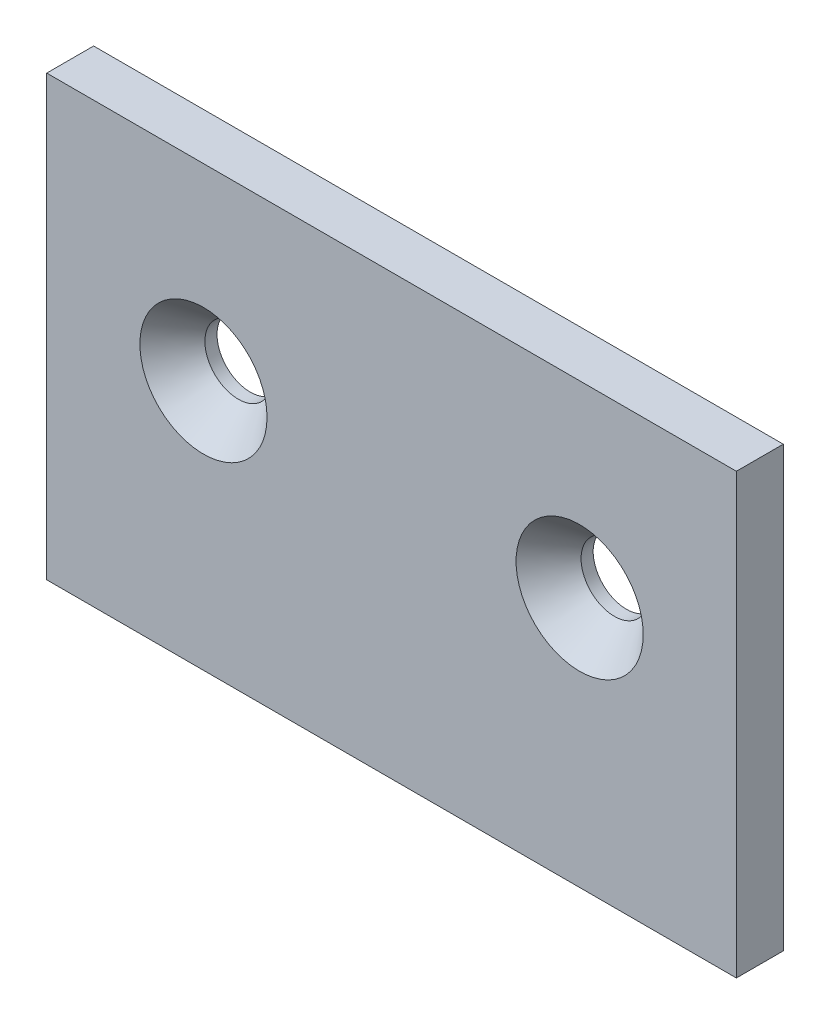
ISO-10303-21;
HEADER;
FILE_DESCRIPTION(('STEP AP214'),'2;1');
FILE_NAME('part.step','',(''),(''),'','','');
FILE_SCHEMA(('AUTOMOTIVE_DESIGN { 1 0 10303 214 1 1 1 1 }'));
ENDSEC;
DATA;
#1=APPLICATION_CONTEXT('core data for automotive mechanical design processes');
#2=APPLICATION_PROTOCOL_DEFINITION('international standard','automotive_design',2000,#1);
#3=PRODUCT_CONTEXT('',#1,'mechanical');
#4=PRODUCT('Part','Part','',(#3));
#5=PRODUCT_RELATED_PRODUCT_CATEGORY('part','',(#4));
#6=PRODUCT_DEFINITION_FORMATION('','',#4);
#7=PRODUCT_DEFINITION_CONTEXT('part definition',#1,'design');
#8=PRODUCT_DEFINITION('design','',#6,#7);
#9=PRODUCT_DEFINITION_SHAPE('','',#8);
#10=(LENGTH_UNIT() NAMED_UNIT(*) SI_UNIT(.MILLI.,.METRE.));
#11=(NAMED_UNIT(*) PLANE_ANGLE_UNIT() SI_UNIT($,.RADIAN.));
#12=(NAMED_UNIT(*) SI_UNIT($,.STERADIAN.) SOLID_ANGLE_UNIT());
#13=UNCERTAINTY_MEASURE_WITH_UNIT(LENGTH_MEASURE(1.E-05),#10,'distance_accuracy_value','');
#14=(GEOMETRIC_REPRESENTATION_CONTEXT(3) GLOBAL_UNCERTAINTY_ASSIGNED_CONTEXT((#13)) GLOBAL_UNIT_ASSIGNED_CONTEXT((#10,
#11,#12)) REPRESENTATION_CONTEXT('',''));
#15=CARTESIAN_POINT('',(0.,0.,0.));
#16=DIRECTION('',(0.,0.,1.));
#17=DIRECTION('',(1.,0.,0.));
#18=AXIS2_PLACEMENT_3D('',#15,#16,#17);
#19=CARTESIAN_POINT('',(-34.925,44.45,-4.7498));
#20=DIRECTION('',(-1.,0.,0.));
#21=DIRECTION('',(0.,-1.,0.));
#22=AXIS2_PLACEMENT_3D('',#19,#20,#21);
#23=PLANE('',#22);
#24=DIRECTION('',(0.,-1.,0.));
#25=VECTOR('',#24,1.);
#26=CARTESIAN_POINT('',(-34.925,44.45,0.));
#27=LINE('',#26,#25);
#28=CARTESIAN_POINT('',(-34.925,44.45,0.));
#29=VERTEX_POINT('',#28);
#30=CARTESIAN_POINT('',(-34.925,0.,0.));
#31=VERTEX_POINT('',#30);
#32=EDGE_CURVE('E105',#29,#31,#27,.T.);
#33=ORIENTED_EDGE('',*,*,#32,.F.);
#34=DIRECTION('',(0.,0.,1.));
#35=VECTOR('',#34,1.);
#36=CARTESIAN_POINT('',(-34.925,44.45,-4.7498));
#37=LINE('',#36,#35);
#38=CARTESIAN_POINT('',(-34.925,44.45,-4.7498));
#39=VERTEX_POINT('',#38);
#40=EDGE_CURVE('E11',#39,#29,#37,.T.);
#41=ORIENTED_EDGE('',*,*,#40,.F.);
#42=DIRECTION('',(0.,-1.,0.));
#43=VECTOR('',#42,1.);
#44=CARTESIAN_POINT('',(-34.925,44.45,-4.7498));
#45=LINE('',#44,#43);
#46=CARTESIAN_POINT('',(-34.925,0.,-4.7498));
#47=VERTEX_POINT('',#46);
#48=EDGE_CURVE('E99',#39,#47,#45,.T.);
#49=ORIENTED_EDGE('',*,*,#48,.T.);
#50=DIRECTION('',(0.,0.,1.));
#51=VECTOR('',#50,1.);
#52=CARTESIAN_POINT('',(-34.925,0.,-4.7498));
#53=LINE('',#52,#51);
#54=EDGE_CURVE('E42',#47,#31,#53,.T.);
#55=ORIENTED_EDGE('',*,*,#54,.T.);
#56=EDGE_LOOP('',(#33,#41,#49,#55));
#57=FACE_BOUND('',#56,.T.);
#58=ADVANCED_FACE('F39',(#57),#23,.T.);
#59=CARTESIAN_POINT('',(-34.925,44.45,-4.7498));
#60=DIRECTION('',(0.,-1.,0.));
#61=DIRECTION('',(1.,0.,0.));
#62=AXIS2_PLACEMENT_3D('',#59,#60,#61);
#63=PLANE('',#62);
#64=DIRECTION('',(1.,0.,0.));
#65=VECTOR('',#64,1.);
#66=CARTESIAN_POINT('',(-34.925,44.45,0.));
#67=LINE('',#66,#65);
#68=CARTESIAN_POINT('',(34.925,44.45,0.));
#69=VERTEX_POINT('',#68);
#70=EDGE_CURVE('E72',#29,#69,#67,.T.);
#71=ORIENTED_EDGE('',*,*,#70,.T.);
#72=DIRECTION('',(0.,0.,1.));
#73=VECTOR('',#72,1.);
#74=CARTESIAN_POINT('',(34.925,44.45,-4.7498));
#75=LINE('',#74,#73);
#76=CARTESIAN_POINT('',(34.925,44.45,-4.7498));
#77=VERTEX_POINT('',#76);
#78=EDGE_CURVE('E48',#77,#69,#75,.T.);
#79=ORIENTED_EDGE('',*,*,#78,.F.);
#80=DIRECTION('',(1.,0.,0.));
#81=VECTOR('',#80,1.);
#82=CARTESIAN_POINT('',(-34.925,44.45,-4.7498));
#83=LINE('',#82,#81);
#84=EDGE_CURVE('E89',#39,#77,#83,.T.);
#85=ORIENTED_EDGE('',*,*,#84,.F.);
#86=ORIENTED_EDGE('',*,*,#40,.T.);
#87=EDGE_LOOP('',(#71,#79,#85,#86));
#88=FACE_BOUND('',#87,.T.);
#89=ADVANCED_FACE('F116',(#88),#63,.F.);
#90=CARTESIAN_POINT('',(34.925,44.45,-4.7498));
#91=DIRECTION('',(-1.,0.,0.));
#92=DIRECTION('',(0.,0.,1.));
#93=AXIS2_PLACEMENT_3D('',#90,#91,#92);
#94=PLANE('',#93);
#95=DIRECTION('',(0.,-1.,0.));
#96=VECTOR('',#95,1.);
#97=CARTESIAN_POINT('',(34.925,44.45,0.));
#98=LINE('',#97,#96);
#99=CARTESIAN_POINT('',(34.925,0.,0.));
#100=VERTEX_POINT('',#99);
#101=EDGE_CURVE('E96',#69,#100,#98,.T.);
#102=ORIENTED_EDGE('',*,*,#101,.T.);
#103=DIRECTION('',(0.,0.,1.));
#104=VECTOR('',#103,1.);
#105=CARTESIAN_POINT('',(34.925,0.,-4.7498));
#106=LINE('',#105,#104);
#107=CARTESIAN_POINT('',(34.925,0.,-4.7498));
#108=VERTEX_POINT('',#107);
#109=EDGE_CURVE('E93',#108,#100,#106,.T.);
#110=ORIENTED_EDGE('',*,*,#109,.F.);
#111=DIRECTION('',(0.,-1.,0.));
#112=VECTOR('',#111,1.);
#113=CARTESIAN_POINT('',(34.925,44.45,-4.7498));
#114=LINE('',#113,#112);
#115=EDGE_CURVE('E84',#77,#108,#114,.T.);
#116=ORIENTED_EDGE('',*,*,#115,.F.);
#117=ORIENTED_EDGE('',*,*,#78,.T.);
#118=EDGE_LOOP('',(#102,#110,#116,#117));
#119=FACE_BOUND('',#118,.T.);
#120=ADVANCED_FACE('F94',(#119),#94,.F.);
#121=CARTESIAN_POINT('',(-34.925,0.,-4.7498));
#122=DIRECTION('',(0.,-1.,0.));
#123=DIRECTION('',(1.,0.,0.));
#124=AXIS2_PLACEMENT_3D('',#121,#122,#123);
#125=PLANE('',#124);
#126=DIRECTION('',(1.,0.,0.));
#127=VECTOR('',#126,1.);
#128=CARTESIAN_POINT('',(-34.925,0.,0.));
#129=LINE('',#128,#127);
#130=EDGE_CURVE('E108',#31,#100,#129,.T.);
#131=ORIENTED_EDGE('',*,*,#130,.F.);
#132=ORIENTED_EDGE('',*,*,#54,.F.);
#133=DIRECTION('',(1.,0.,0.));
#134=VECTOR('',#133,1.);
#135=CARTESIAN_POINT('',(-34.925,0.,-4.7498));
#136=LINE('',#135,#134);
#137=EDGE_CURVE('E88',#47,#108,#136,.T.);
#138=ORIENTED_EDGE('',*,*,#137,.T.);
#139=ORIENTED_EDGE('',*,*,#109,.T.);
#140=EDGE_LOOP('',(#131,#132,#138,#139));
#141=FACE_BOUND('',#140,.T.);
#142=ADVANCED_FACE('F98',(#141),#125,.T.);
#143=CARTESIAN_POINT('',(0.,0.,-4.7498));
#144=DIRECTION('',(0.,0.,1.));
#145=DIRECTION('',(1.,0.,0.));
#146=AXIS2_PLACEMENT_3D('',#143,#144,#145);
#147=PLANE('',#146);
#148=CARTESIAN_POINT('',(-19.05,25.4,-4.7498));
#149=DIRECTION('',(0.,0.,1.));
#150=DIRECTION('',(1.,0.,0.));
#151=AXIS2_PLACEMENT_3D('',#148,#149,#150);
#152=CIRCLE('',#151,3.3782);
#153=CARTESIAN_POINT('',(-15.6718,25.4,-4.7498));
#154=VERTEX_POINT('',#153);
#155=EDGE_CURVE('E164',#154,#154,#152,.T.);
#156=ORIENTED_EDGE('',*,*,#155,.T.);
#157=EDGE_LOOP('',(#156));
#158=FACE_BOUND('',#157,.T.);
#159=CARTESIAN_POINT('',(19.05,25.4,-4.7498));
#160=DIRECTION('',(0.,0.,1.));
#161=DIRECTION('',(1.,0.,0.));
#162=AXIS2_PLACEMENT_3D('',#159,#160,#161);
#163=CIRCLE('',#162,3.3782);
#164=CARTESIAN_POINT('',(22.4282,25.4,-4.7498));
#165=VERTEX_POINT('',#164);
#166=EDGE_CURVE('E109',#165,#165,#163,.T.);
#167=ORIENTED_EDGE('',*,*,#166,.T.);
#168=EDGE_LOOP('',(#167));
#169=FACE_BOUND('',#168,.T.);
#170=ORIENTED_EDGE('',*,*,#48,.F.);
#171=ORIENTED_EDGE('',*,*,#84,.T.);
#172=ORIENTED_EDGE('',*,*,#115,.T.);
#173=ORIENTED_EDGE('',*,*,#137,.F.);
#174=EDGE_LOOP('',(#170,#171,#172,#173));
#175=FACE_BOUND('',#174,.T.);
#176=ADVANCED_FACE('F87',(#158,#169,#175),#147,.F.);
#177=CARTESIAN_POINT('',(0.,0.,0.));
#178=DIRECTION('',(0.,0.,1.));
#179=DIRECTION('',(1.,0.,0.));
#180=AXIS2_PLACEMENT_3D('',#177,#178,#179);
#181=PLANE('',#180);
#182=CARTESIAN_POINT('',(-19.05,25.4,0.));
#183=DIRECTION('',(0.,0.,1.));
#184=DIRECTION('',(1.,0.,0.));
#185=AXIS2_PLACEMENT_3D('',#182,#183,#184);
#186=CIRCLE('',#185,6.4389);
#187=CARTESIAN_POINT('',(-12.6111,25.4,0.));
#188=VERTEX_POINT('',#187);
#189=EDGE_CURVE('E162',#188,#188,#186,.T.);
#190=ORIENTED_EDGE('',*,*,#189,.F.);
#191=EDGE_LOOP('',(#190));
#192=FACE_BOUND('',#191,.T.);
#193=CARTESIAN_POINT('',(19.05,25.4,0.));
#194=DIRECTION('',(0.,0.,1.));
#195=DIRECTION('',(1.,0.,0.));
#196=AXIS2_PLACEMENT_3D('',#193,#194,#195);
#197=CIRCLE('',#196,6.4389);
#198=CARTESIAN_POINT('',(25.4889,25.4,0.));
#199=VERTEX_POINT('',#198);
#200=EDGE_CURVE('E168',#199,#199,#197,.T.);
#201=ORIENTED_EDGE('',*,*,#200,.F.);
#202=EDGE_LOOP('',(#201));
#203=FACE_BOUND('',#202,.T.);
#204=ORIENTED_EDGE('',*,*,#32,.T.);
#205=ORIENTED_EDGE('',*,*,#130,.T.);
#206=ORIENTED_EDGE('',*,*,#101,.F.);
#207=ORIENTED_EDGE('',*,*,#70,.F.);
#208=EDGE_LOOP('',(#204,#205,#206,#207));
#209=FACE_BOUND('',#208,.T.);
#210=ADVANCED_FACE('F114',(#192,#203,#209),#181,.T.);
#211=CARTESIAN_POINT('',(19.05,25.4,0.));
#212=DIRECTION('',(0.,0.,1.));
#213=DIRECTION('',(1.,0.,0.));
#214=AXIS2_PLACEMENT_3D('',#211,#212,#213);
#215=CYLINDRICAL_SURFACE('',#214,3.37819999999999);
#216=ORIENTED_EDGE('',*,*,#166,.F.);
#217=EDGE_LOOP('',(#216));
#218=FACE_BOUND('',#217,.T.);
#219=CARTESIAN_POINT('',(19.05,25.4,-3.52093258398135));
#220=DIRECTION('',(0.,0.,1.));
#221=DIRECTION('',(1.,0.,0.));
#222=AXIS2_PLACEMENT_3D('',#219,#220,#221);
#223=CIRCLE('',#222,3.37819999999999);
#224=CARTESIAN_POINT('',(22.4282,25.4,-3.52093258398135));
#225=VERTEX_POINT('',#224);
#226=EDGE_CURVE('E171',#225,#225,#223,.T.);
#227=ORIENTED_EDGE('',*,*,#226,.T.);
#228=EDGE_LOOP('',(#227));
#229=FACE_BOUND('',#228,.T.);
#230=ADVANCED_FACE('F135',(#218,#229),#215,.F.);
#231=CARTESIAN_POINT('',(19.05,25.4,0.));
#232=DIRECTION('',(0.,0.,1.));
#233=DIRECTION('',(1.,0.,0.));
#234=AXIS2_PLACEMENT_3D('',#231,#232,#233);
#235=CONICAL_SURFACE('',#234,6.4389,0.715584993317676);
#236=ORIENTED_EDGE('',*,*,#226,.F.);
#237=EDGE_LOOP('',(#236));
#238=FACE_BOUND('',#237,.T.);
#239=ORIENTED_EDGE('',*,*,#200,.T.);
#240=EDGE_LOOP('',(#239));
#241=FACE_BOUND('',#240,.T.);
#242=ADVANCED_FACE('F142',(#238,#241),#235,.F.);
#243=CARTESIAN_POINT('',(-19.05,25.4,0.));
#244=DIRECTION('',(0.,0.,1.));
#245=DIRECTION('',(1.,0.,0.));
#246=AXIS2_PLACEMENT_3D('',#243,#244,#245);
#247=CYLINDRICAL_SURFACE('',#246,3.37819999999999);
#248=ORIENTED_EDGE('',*,*,#155,.F.);
#249=EDGE_LOOP('',(#248));
#250=FACE_BOUND('',#249,.T.);
#251=CARTESIAN_POINT('',(-19.05,25.4,-3.52093258398135));
#252=DIRECTION('',(0.,0.,1.));
#253=DIRECTION('',(1.,0.,0.));
#254=AXIS2_PLACEMENT_3D('',#251,#252,#253);
#255=CIRCLE('',#254,3.37819999999999);
#256=CARTESIAN_POINT('',(-15.6718,25.4,-3.52093258398135));
#257=VERTEX_POINT('',#256);
#258=EDGE_CURVE('E159',#257,#257,#255,.T.);
#259=ORIENTED_EDGE('',*,*,#258,.T.);
#260=EDGE_LOOP('',(#259));
#261=FACE_BOUND('',#260,.T.);
#262=ADVANCED_FACE('F146',(#250,#261),#247,.F.);
#263=CARTESIAN_POINT('',(-19.05,25.4,0.));
#264=DIRECTION('',(0.,0.,1.));
#265=DIRECTION('',(1.,0.,0.));
#266=AXIS2_PLACEMENT_3D('',#263,#264,#265);
#267=CONICAL_SURFACE('',#266,6.4389,0.715584993317676);
#268=ORIENTED_EDGE('',*,*,#258,.F.);
#269=EDGE_LOOP('',(#268));
#270=FACE_BOUND('',#269,.T.);
#271=ORIENTED_EDGE('',*,*,#189,.T.);
#272=EDGE_LOOP('',(#271));
#273=FACE_BOUND('',#272,.T.);
#274=ADVANCED_FACE('F150',(#270,#273),#267,.F.);
#275=CLOSED_SHELL('',(#58,#89,#120,#142,#176,#210,#230,#242,#262,#274));
#276=MANIFOLD_SOLID_BREP('B2',#275);
#277=ADVANCED_BREP_SHAPE_REPRESENTATION('',(#18,#276),#14);
#278=SHAPE_DEFINITION_REPRESENTATION(#9,#277);
ENDSEC;
END-ISO-10303-21;
